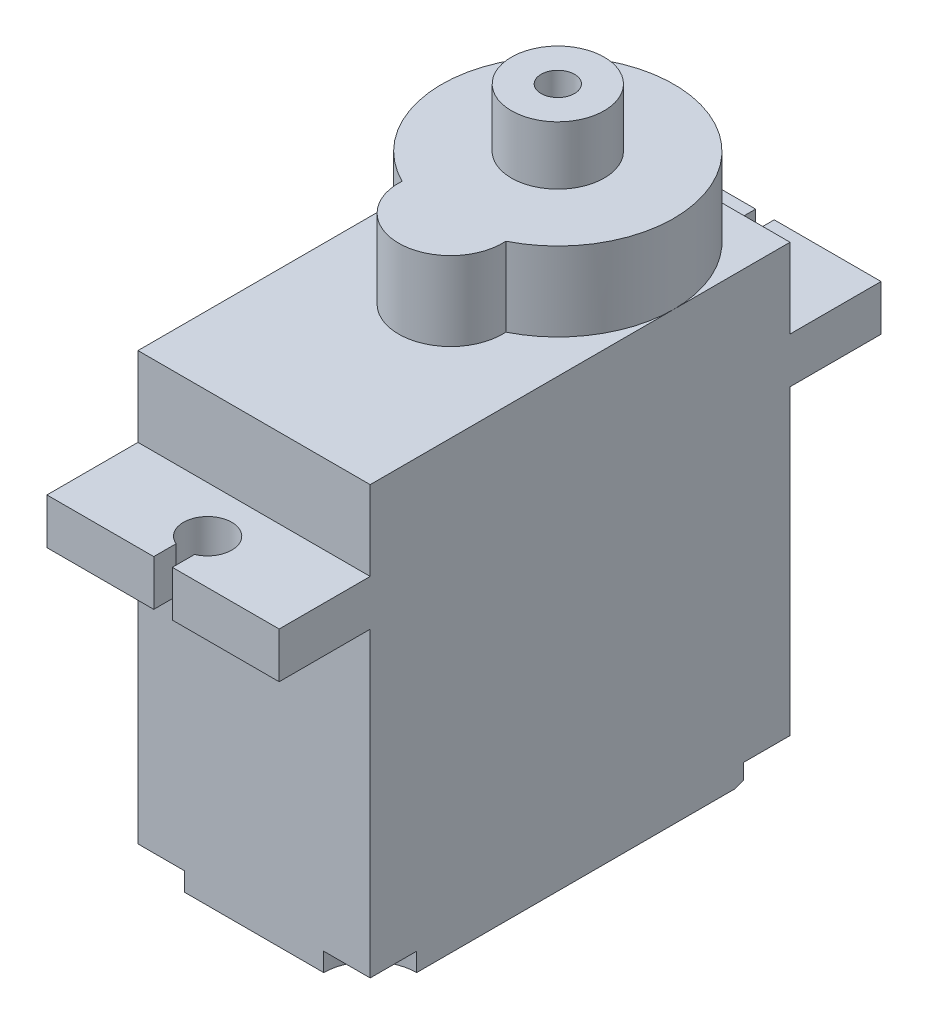
ISO-10303-21;
HEADER;
FILE_DESCRIPTION(('STEP AP214'),'2;1');
FILE_NAME('part.step','',(''),(''),'','','');
FILE_SCHEMA(('AUTOMOTIVE_DESIGN { 1 0 10303 214 1 1 1 1 }'));
ENDSEC;
DATA;
#1=APPLICATION_CONTEXT('core data for automotive mechanical design processes');
#2=APPLICATION_PROTOCOL_DEFINITION('international standard','automotive_design',2000,#1);
#3=PRODUCT_CONTEXT('',#1,'mechanical');
#4=PRODUCT('Part','Part','',(#3));
#5=PRODUCT_RELATED_PRODUCT_CATEGORY('part','',(#4));
#6=PRODUCT_DEFINITION_FORMATION('','',#4);
#7=PRODUCT_DEFINITION_CONTEXT('part definition',#1,'design');
#8=PRODUCT_DEFINITION('design','',#6,#7);
#9=PRODUCT_DEFINITION_SHAPE('','',#8);
#10=(LENGTH_UNIT() NAMED_UNIT(*) SI_UNIT(.MILLI.,.METRE.));
#11=(NAMED_UNIT(*) PLANE_ANGLE_UNIT() SI_UNIT($,.RADIAN.));
#12=(NAMED_UNIT(*) SI_UNIT($,.STERADIAN.) SOLID_ANGLE_UNIT());
#13=UNCERTAINTY_MEASURE_WITH_UNIT(LENGTH_MEASURE(1.E-05),#10,'distance_accuracy_value','');
#14=(GEOMETRIC_REPRESENTATION_CONTEXT(3) GLOBAL_UNCERTAINTY_ASSIGNED_CONTEXT((#13)) GLOBAL_UNIT_ASSIGNED_CONTEXT((#10,
#11,#12)) REPRESENTATION_CONTEXT('',''));
#15=CARTESIAN_POINT('',(0.,0.,0.));
#16=DIRECTION('',(0.,0.,1.));
#17=DIRECTION('',(1.,0.,0.));
#18=AXIS2_PLACEMENT_3D('',#15,#16,#17);
#19=CARTESIAN_POINT('',(6.25,4.28,11.3));
#20=DIRECTION('',(0.,-1.,0.));
#21=DIRECTION('',(0.,0.,-1.));
#22=AXIS2_PLACEMENT_3D('',#19,#20,#21);
#23=PLANE('',#22);
#24=CARTESIAN_POINT('',(0.,4.28,0.719999999999996));
#25=DIRECTION('',(0.,1.,0.));
#26=DIRECTION('',(0.,0.,1.));
#27=AXIS2_PLACEMENT_3D('',#24,#25,#26);
#28=CIRCLE('',#27,2.8);
#29=CARTESIAN_POINT('',(-2.79424619253468,4.28,0.540589254766044));
#30=VERTEX_POINT('',#29);
#31=CARTESIAN_POINT('',(2.79424619253469,4.28,0.54058925476604));
#32=VERTEX_POINT('',#31);
#33=EDGE_CURVE('E460',#30,#32,#28,.T.);
#34=ORIENTED_EDGE('',*,*,#33,.F.);
#35=CARTESIAN_POINT('',(0.,4.28000000000001,-5.04999999999999));
#36=DIRECTION('',(0.,1.,0.));
#37=DIRECTION('',(0.,0.,1.));
#38=AXIS2_PLACEMENT_3D('',#35,#36,#37);
#39=CIRCLE('',#38,6.25);
#40=CARTESIAN_POINT('',(-6.25,4.28000000000001,-5.04999999999999));
#41=VERTEX_POINT('',#40);
#42=EDGE_CURVE('E352',#41,#30,#39,.T.);
#43=ORIENTED_EDGE('',*,*,#42,.F.);
#44=DIRECTION('',(0.,0.,1.));
#45=VECTOR('',#44,1.);
#46=CARTESIAN_POINT('',(-6.25,4.28,11.3));
#47=LINE('',#46,#45);
#48=CARTESIAN_POINT('',(-6.25,4.28,11.3));
#49=VERTEX_POINT('',#48);
#50=EDGE_CURVE('E300',#41,#49,#47,.T.);
#51=ORIENTED_EDGE('',*,*,#50,.T.);
#52=DIRECTION('',(-1.,0.,0.));
#53=VECTOR('',#52,1.);
#54=CARTESIAN_POINT('',(6.25,4.28,11.3));
#55=LINE('',#54,#53);
#56=CARTESIAN_POINT('',(6.25,4.28,11.3));
#57=VERTEX_POINT('',#56);
#58=EDGE_CURVE('E305',#57,#49,#55,.T.);
#59=ORIENTED_EDGE('',*,*,#58,.F.);
#60=DIRECTION('',(0.,0.,1.));
#61=VECTOR('',#60,1.);
#62=CARTESIAN_POINT('',(6.25,4.28,11.3));
#63=LINE('',#62,#61);
#64=CARTESIAN_POINT('',(6.25,4.28000000000001,-5.04999999999999));
#65=VERTEX_POINT('',#64);
#66=EDGE_CURVE('E393',#65,#57,#63,.T.);
#67=ORIENTED_EDGE('',*,*,#66,.F.);
#68=EDGE_CURVE('E467',#32,#65,#39,.T.);
#69=ORIENTED_EDGE('',*,*,#68,.F.);
#70=EDGE_LOOP('',(#34,#43,#51,#59,#67,#69));
#71=FACE_BOUND('',#70,.T.);
#72=ADVANCED_FACE('F48',(#71),#23,.F.);
#73=CARTESIAN_POINT('',(0.,4.28000000000001,-11.3));
#74=VERTEX_POINT('',#73);
#75=EDGE_CURVE('E357',#65,#74,#39,.T.);
#76=ORIENTED_EDGE('',*,*,#75,.F.);
#77=CARTESIAN_POINT('',(6.25,4.28000000000001,-11.3));
#78=VERTEX_POINT('',#77);
#79=EDGE_CURVE('E309',#78,#65,#63,.T.);
#80=ORIENTED_EDGE('',*,*,#79,.F.);
#81=DIRECTION('',(-1.,0.,0.));
#82=VECTOR('',#81,1.);
#83=CARTESIAN_POINT('',(6.25,4.28000000000001,-11.3));
#84=LINE('',#83,#82);
#85=EDGE_CURVE('E310',#78,#74,#84,.T.);
#86=ORIENTED_EDGE('',*,*,#85,.T.);
#87=EDGE_LOOP('',(#76,#80,#86));
#88=FACE_BOUND('',#87,.T.);
#89=ADVANCED_FACE('F572',(#88),#23,.F.);
#90=CARTESIAN_POINT('',(6.25,0.,16.2));
#91=DIRECTION('',(0.,0.,-1.));
#92=DIRECTION('',(-1.,0.,0.));
#93=AXIS2_PLACEMENT_3D('',#90,#91,#92);
#94=PLANE('',#93);
#95=DIRECTION('',(-1.,0.,0.));
#96=VECTOR('',#95,1.);
#97=CARTESIAN_POINT('',(6.25,0.,16.2));
#98=LINE('',#97,#96);
#99=CARTESIAN_POINT('',(6.25,0.,16.2));
#100=VERTEX_POINT('',#99);
#101=CARTESIAN_POINT('',(0.5,0.,16.2));
#102=VERTEX_POINT('',#101);
#103=EDGE_CURVE('E337',#100,#102,#98,.T.);
#104=ORIENTED_EDGE('',*,*,#103,.T.);
#105=DIRECTION('',(0.,1.,0.));
#106=VECTOR('',#105,1.);
#107=CARTESIAN_POINT('',(0.5,-12.5,16.2));
#108=LINE('',#107,#106);
#109=CARTESIAN_POINT('',(0.5,-2.46,16.2));
#110=VERTEX_POINT('',#109);
#111=EDGE_CURVE('E508',#110,#102,#108,.T.);
#112=ORIENTED_EDGE('',*,*,#111,.F.);
#113=DIRECTION('',(-1.,0.,0.));
#114=VECTOR('',#113,1.);
#115=CARTESIAN_POINT('',(6.25,-2.46,16.2));
#116=LINE('',#115,#114);
#117=CARTESIAN_POINT('',(6.25,-2.46,16.2));
#118=VERTEX_POINT('',#117);
#119=EDGE_CURVE('E333',#118,#110,#116,.T.);
#120=ORIENTED_EDGE('',*,*,#119,.F.);
#121=DIRECTION('',(0.,-1.,0.));
#122=VECTOR('',#121,1.);
#123=CARTESIAN_POINT('',(6.25,0.,16.2));
#124=LINE('',#123,#122);
#125=EDGE_CURVE('E525',#100,#118,#124,.T.);
#126=ORIENTED_EDGE('',*,*,#125,.F.);
#127=EDGE_LOOP('',(#104,#112,#120,#126));
#128=FACE_BOUND('',#127,.T.);
#129=ADVANCED_FACE('F533',(#128),#94,.F.);
#130=CARTESIAN_POINT('',(6.25,0.,-16.2));
#131=DIRECTION('',(0.,0.,1.));
#132=DIRECTION('',(1.,0.,0.));
#133=AXIS2_PLACEMENT_3D('',#130,#131,#132);
#134=PLANE('',#133);
#135=DIRECTION('',(-1.,0.,0.));
#136=VECTOR('',#135,1.);
#137=CARTESIAN_POINT('',(6.25,0.,-16.2));
#138=LINE('',#137,#136);
#139=CARTESIAN_POINT('',(-0.5,0.,-16.2));
#140=VERTEX_POINT('',#139);
#141=CARTESIAN_POINT('',(-6.25,0.,-16.2));
#142=VERTEX_POINT('',#141);
#143=EDGE_CURVE('E316',#140,#142,#138,.T.);
#144=ORIENTED_EDGE('',*,*,#143,.F.);
#145=DIRECTION('',(0.,1.,0.));
#146=VECTOR('',#145,1.);
#147=CARTESIAN_POINT('',(-0.5,-12.5,-16.2));
#148=LINE('',#147,#146);
#149=CARTESIAN_POINT('',(-0.5,-2.46,-16.2));
#150=VERTEX_POINT('',#149);
#151=EDGE_CURVE('E492',#150,#140,#148,.T.);
#152=ORIENTED_EDGE('',*,*,#151,.F.);
#153=DIRECTION('',(-1.,0.,0.));
#154=VECTOR('',#153,1.);
#155=CARTESIAN_POINT('',(6.25,-2.46,-16.2));
#156=LINE('',#155,#154);
#157=CARTESIAN_POINT('',(-6.25,-2.46,-16.2));
#158=VERTEX_POINT('',#157);
#159=EDGE_CURVE('E320',#150,#158,#156,.T.);
#160=ORIENTED_EDGE('',*,*,#159,.T.);
#161=DIRECTION('',(0.,1.,0.));
#162=VECTOR('',#161,1.);
#163=CARTESIAN_POINT('',(-6.25,0.,-16.2));
#164=LINE('',#163,#162);
#165=EDGE_CURVE('E292',#158,#142,#164,.T.);
#166=ORIENTED_EDGE('',*,*,#165,.T.);
#167=EDGE_LOOP('',(#144,#152,#160,#166));
#168=FACE_BOUND('',#167,.T.);
#169=ADVANCED_FACE('F589',(#168),#134,.F.);
#170=CARTESIAN_POINT('',(6.25,4.28,11.3));
#171=DIRECTION('',(0.,0.,-1.));
#172=DIRECTION('',(0.,1.,0.));
#173=AXIS2_PLACEMENT_3D('',#170,#171,#172);
#174=PLANE('',#173);
#175=DIRECTION('',(0.,-1.,0.));
#176=VECTOR('',#175,1.);
#177=CARTESIAN_POINT('',(-6.25,4.28,11.3));
#178=LINE('',#177,#176);
#179=CARTESIAN_POINT('',(-6.25,0.,11.3));
#180=VERTEX_POINT('',#179);
#181=EDGE_CURVE('E396',#49,#180,#178,.T.);
#182=ORIENTED_EDGE('',*,*,#181,.T.);
#183=DIRECTION('',(-1.,0.,0.));
#184=VECTOR('',#183,1.);
#185=CARTESIAN_POINT('',(6.25,0.,11.3));
#186=LINE('',#185,#184);
#187=CARTESIAN_POINT('',(6.25,0.,11.3));
#188=VERTEX_POINT('',#187);
#189=EDGE_CURVE('E340',#188,#180,#186,.T.);
#190=ORIENTED_EDGE('',*,*,#189,.F.);
#191=DIRECTION('',(0.,-1.,0.));
#192=VECTOR('',#191,1.);
#193=CARTESIAN_POINT('',(6.25,4.28,11.3));
#194=LINE('',#193,#192);
#195=EDGE_CURVE('E304',#57,#188,#194,.T.);
#196=ORIENTED_EDGE('',*,*,#195,.F.);
#197=ORIENTED_EDGE('',*,*,#58,.T.);
#198=EDGE_LOOP('',(#182,#190,#196,#197));
#199=FACE_BOUND('',#198,.T.);
#200=ADVANCED_FACE('F50',(#199),#174,.F.);
#201=CARTESIAN_POINT('',(6.25,0.,11.3));
#202=DIRECTION('',(0.,-1.,0.));
#203=DIRECTION('',(0.,0.,-1.));
#204=AXIS2_PLACEMENT_3D('',#201,#202,#203);
#205=PLANE('',#204);
#206=CARTESIAN_POINT('',(0.,0.,13.8));
#207=DIRECTION('',(0.,1.,0.));
#208=DIRECTION('',(0.,0.,-1.));
#209=AXIS2_PLACEMENT_3D('',#206,#207,#208);
#210=CIRCLE('',#209,1.3);
#211=CARTESIAN_POINT('',(0.5,0.,15.));
#212=VERTEX_POINT('',#211);
#213=CARTESIAN_POINT('',(-0.5,0.,15.));
#214=VERTEX_POINT('',#213);
#215=EDGE_CURVE('E479',#212,#214,#210,.T.);
#216=ORIENTED_EDGE('',*,*,#215,.F.);
#217=DIRECTION('',(0.,0.,-1.));
#218=VECTOR('',#217,1.);
#219=CARTESIAN_POINT('',(0.5,0.,15.));
#220=LINE('',#219,#218);
#221=EDGE_CURVE('E503',#102,#212,#220,.T.);
#222=ORIENTED_EDGE('',*,*,#221,.F.);
#223=ORIENTED_EDGE('',*,*,#103,.F.);
#224=DIRECTION('',(0.,0.,1.));
#225=VECTOR('',#224,1.);
#226=CARTESIAN_POINT('',(6.25,0.,11.3));
#227=LINE('',#226,#225);
#228=EDGE_CURVE('E523',#188,#100,#227,.T.);
#229=ORIENTED_EDGE('',*,*,#228,.F.);
#230=ORIENTED_EDGE('',*,*,#189,.T.);
#231=DIRECTION('',(0.,0.,1.));
#232=VECTOR('',#231,1.);
#233=CARTESIAN_POINT('',(-6.25,0.,11.3));
#234=LINE('',#233,#232);
#235=CARTESIAN_POINT('',(-6.25,0.,16.2));
#236=VERTEX_POINT('',#235);
#237=EDGE_CURVE('E399',#180,#236,#234,.T.);
#238=ORIENTED_EDGE('',*,*,#237,.T.);
#239=CARTESIAN_POINT('',(-0.5,0.,16.2));
#240=VERTEX_POINT('',#239);
#241=EDGE_CURVE('E336',#240,#236,#98,.T.);
#242=ORIENTED_EDGE('',*,*,#241,.F.);
#243=DIRECTION('',(0.,0.,1.));
#244=VECTOR('',#243,1.);
#245=CARTESIAN_POINT('',(-0.5,0.,15.));
#246=LINE('',#245,#244);
#247=EDGE_CURVE('E501',#214,#240,#246,.T.);
#248=ORIENTED_EDGE('',*,*,#247,.F.);
#249=EDGE_LOOP('',(#216,#222,#223,#229,#230,#238,#242,#248));
#250=FACE_BOUND('',#249,.T.);
#251=ADVANCED_FACE('F541',(#250),#205,.F.);
#252=CARTESIAN_POINT('',(-0.5,-2.46,16.2));
#253=VERTEX_POINT('',#252);
#254=CARTESIAN_POINT('',(-6.25,-2.46,16.2));
#255=VERTEX_POINT('',#254);
#256=EDGE_CURVE('E332',#253,#255,#116,.T.);
#257=ORIENTED_EDGE('',*,*,#256,.F.);
#258=DIRECTION('',(0.,1.,0.));
#259=VECTOR('',#258,1.);
#260=CARTESIAN_POINT('',(-0.5,-12.5,16.2));
#261=LINE('',#260,#259);
#262=EDGE_CURVE('E510',#253,#240,#261,.T.);
#263=ORIENTED_EDGE('',*,*,#262,.T.);
#264=ORIENTED_EDGE('',*,*,#241,.T.);
#265=DIRECTION('',(0.,-1.,0.));
#266=VECTOR('',#265,1.);
#267=CARTESIAN_POINT('',(-6.25,0.,16.2));
#268=LINE('',#267,#266);
#269=EDGE_CURVE('E403',#236,#255,#268,.T.);
#270=ORIENTED_EDGE('',*,*,#269,.T.);
#271=EDGE_LOOP('',(#257,#263,#264,#270));
#272=FACE_BOUND('',#271,.T.);
#273=ADVANCED_FACE('F549',(#272),#94,.F.);
#274=CARTESIAN_POINT('',(6.25,-2.46,11.3));
#275=DIRECTION('',(0.,1.,0.));
#276=DIRECTION('',(0.,0.,1.));
#277=AXIS2_PLACEMENT_3D('',#274,#275,#276);
#278=PLANE('',#277);
#279=ORIENTED_EDGE('',*,*,#119,.T.);
#280=DIRECTION('',(0.,0.,-1.));
#281=VECTOR('',#280,1.);
#282=CARTESIAN_POINT('',(0.5,-2.46,11.3));
#283=LINE('',#282,#281);
#284=CARTESIAN_POINT('',(0.5,-2.46,15.));
#285=VERTEX_POINT('',#284);
#286=EDGE_CURVE('E349',#110,#285,#283,.T.);
#287=ORIENTED_EDGE('',*,*,#286,.T.);
#288=CARTESIAN_POINT('',(0.,-2.46,13.8));
#289=DIRECTION('',(0.,1.,0.));
#290=DIRECTION('',(0.,0.,1.));
#291=AXIS2_PLACEMENT_3D('',#288,#289,#290);
#292=CIRCLE('',#291,1.3);
#293=CARTESIAN_POINT('',(-0.5,-2.46,15.));
#294=VERTEX_POINT('',#293);
#295=EDGE_CURVE('E346',#285,#294,#292,.T.);
#296=ORIENTED_EDGE('',*,*,#295,.T.);
#297=DIRECTION('',(0.,0.,1.));
#298=VECTOR('',#297,1.);
#299=CARTESIAN_POINT('',(-0.5,-2.46,11.3));
#300=LINE('',#299,#298);
#301=EDGE_CURVE('E343',#294,#253,#300,.T.);
#302=ORIENTED_EDGE('',*,*,#301,.T.);
#303=ORIENTED_EDGE('',*,*,#256,.T.);
#304=DIRECTION('',(0.,0.,-1.));
#305=VECTOR('',#304,1.);
#306=CARTESIAN_POINT('',(-6.25,-2.46,11.3));
#307=LINE('',#306,#305);
#308=CARTESIAN_POINT('',(-6.25,-2.46,11.3));
#309=VERTEX_POINT('',#308);
#310=EDGE_CURVE('E286',#255,#309,#307,.T.);
#311=ORIENTED_EDGE('',*,*,#310,.T.);
#312=DIRECTION('',(-1.,0.,0.));
#313=VECTOR('',#312,1.);
#314=CARTESIAN_POINT('',(6.25,-2.46,11.3));
#315=LINE('',#314,#313);
#316=CARTESIAN_POINT('',(6.25,-2.46,11.3));
#317=VERTEX_POINT('',#316);
#318=EDGE_CURVE('E329',#317,#309,#315,.T.);
#319=ORIENTED_EDGE('',*,*,#318,.F.);
#320=DIRECTION('',(0.,0.,-1.));
#321=VECTOR('',#320,1.);
#322=CARTESIAN_POINT('',(6.25,-2.46,11.3));
#323=LINE('',#322,#321);
#324=EDGE_CURVE('E527',#118,#317,#323,.T.);
#325=ORIENTED_EDGE('',*,*,#324,.F.);
#326=EDGE_LOOP('',(#279,#287,#296,#302,#303,#311,#319,#325));
#327=FACE_BOUND('',#326,.T.);
#328=ADVANCED_FACE('F408',(#327),#278,.F.);
#329=CARTESIAN_POINT('',(6.25,-2.46,11.3));
#330=DIRECTION('',(0.,0.,-1.));
#331=DIRECTION('',(-1.,0.,0.));
#332=AXIS2_PLACEMENT_3D('',#329,#330,#331);
#333=PLANE('',#332);
#334=DIRECTION('',(1.,0.,0.));
#335=VECTOR('',#334,1.);
#336=CARTESIAN_POINT('',(6.25,-18.72,11.3));
#337=LINE('',#336,#335);
#338=CARTESIAN_POINT('',(-6.25,-18.72,11.3));
#339=VERTEX_POINT('',#338);
#340=CARTESIAN_POINT('',(-3.75,-18.72,11.3));
#341=VERTEX_POINT('',#340);
#342=EDGE_CURVE('E425',#339,#341,#337,.T.);
#343=ORIENTED_EDGE('',*,*,#342,.T.);
#344=DIRECTION('',(0.,-1.,0.));
#345=VECTOR('',#344,1.);
#346=CARTESIAN_POINT('',(-3.75,-18.72,11.3));
#347=LINE('',#346,#345);
#348=CARTESIAN_POINT('',(-3.75,-19.72,11.3));
#349=VERTEX_POINT('',#348);
#350=EDGE_CURVE('E429',#341,#349,#347,.T.);
#351=ORIENTED_EDGE('',*,*,#350,.T.);
#352=DIRECTION('',(-1.,0.,0.));
#353=VECTOR('',#352,1.);
#354=CARTESIAN_POINT('',(6.25,-19.72,11.3));
#355=LINE('',#354,#353);
#356=CARTESIAN_POINT('',(3.75,-19.72,11.3));
#357=VERTEX_POINT('',#356);
#358=EDGE_CURVE('E327',#357,#349,#355,.T.);
#359=ORIENTED_EDGE('',*,*,#358,.F.);
#360=DIRECTION('',(0.,-1.,0.));
#361=VECTOR('',#360,1.);
#362=CARTESIAN_POINT('',(3.75,-18.72,11.3));
#363=LINE('',#362,#361);
#364=CARTESIAN_POINT('',(3.75,-18.72,11.3));
#365=VERTEX_POINT('',#364);
#366=EDGE_CURVE('E449',#357,#365,#363,.F.);
#367=ORIENTED_EDGE('',*,*,#366,.T.);
#368=DIRECTION('',(-1.,0.,0.));
#369=VECTOR('',#368,1.);
#370=CARTESIAN_POINT('',(6.25,-18.72,11.3));
#371=LINE('',#370,#369);
#372=CARTESIAN_POINT('',(6.25,-18.72,11.3));
#373=VERTEX_POINT('',#372);
#374=EDGE_CURVE('E447',#373,#365,#371,.T.);
#375=ORIENTED_EDGE('',*,*,#374,.F.);
#376=DIRECTION('',(0.,-1.,0.));
#377=VECTOR('',#376,1.);
#378=CARTESIAN_POINT('',(6.25,-2.46,11.3));
#379=LINE('',#378,#377);
#380=EDGE_CURVE('E384',#317,#373,#379,.T.);
#381=ORIENTED_EDGE('',*,*,#380,.F.);
#382=ORIENTED_EDGE('',*,*,#318,.T.);
#383=DIRECTION('',(0.,-1.,0.));
#384=VECTOR('',#383,1.);
#385=CARTESIAN_POINT('',(-6.25,-2.46,11.3));
#386=LINE('',#385,#384);
#387=EDGE_CURVE('E281',#309,#339,#386,.T.);
#388=ORIENTED_EDGE('',*,*,#387,.T.);
#389=EDGE_LOOP('',(#343,#351,#359,#367,#375,#381,#382,#388));
#390=FACE_BOUND('',#389,.T.);
#391=ADVANCED_FACE('F416',(#390),#333,.F.);
#392=CARTESIAN_POINT('',(6.25,-19.72,11.3));
#393=DIRECTION('',(0.,1.,0.));
#394=DIRECTION('',(0.,0.,1.));
#395=AXIS2_PLACEMENT_3D('',#392,#393,#394);
#396=PLANE('',#395);
#397=DIRECTION('',(0.,0.,-1.));
#398=VECTOR('',#397,1.);
#399=CARTESIAN_POINT('',(-6.25,-19.72,11.3));
#400=LINE('',#399,#398);
#401=CARTESIAN_POINT('',(-6.25,-19.72,8.8));
#402=VERTEX_POINT('',#401);
#403=CARTESIAN_POINT('',(-6.25,-19.72,-8.3));
#404=VERTEX_POINT('',#403);
#405=EDGE_CURVE('E272',#402,#404,#400,.T.);
#406=ORIENTED_EDGE('',*,*,#405,.T.);
#407=DIRECTION('',(-1.,0.,0.));
#408=VECTOR('',#407,1.);
#409=CARTESIAN_POINT('',(9.41227766016838,-19.72,-8.3));
#410=LINE('',#409,#408);
#411=CARTESIAN_POINT('',(6.25,-19.72,-8.3));
#412=VERTEX_POINT('',#411);
#413=EDGE_CURVE('E254',#412,#404,#410,.T.);
#414=ORIENTED_EDGE('',*,*,#413,.F.);
#415=DIRECTION('',(0.,0.,-1.));
#416=VECTOR('',#415,1.);
#417=CARTESIAN_POINT('',(6.25,-19.72,11.3));
#418=LINE('',#417,#416);
#419=CARTESIAN_POINT('',(6.25,-19.72,8.8));
#420=VERTEX_POINT('',#419);
#421=EDGE_CURVE('E380',#420,#412,#418,.T.);
#422=ORIENTED_EDGE('',*,*,#421,.F.);
#423=CARTESIAN_POINT('',(6.25,-19.72,11.3));
#424=DIRECTION('',(0.,-1.,0.));
#425=DIRECTION('',(0.,0.,-1.));
#426=AXIS2_PLACEMENT_3D('',#423,#424,#425);
#427=CIRCLE('',#426,2.5);
#428=EDGE_CURVE('E441',#357,#420,#427,.T.);
#429=ORIENTED_EDGE('',*,*,#428,.F.);
#430=ORIENTED_EDGE('',*,*,#358,.T.);
#431=CARTESIAN_POINT('',(-6.25,-19.72,11.3));
#432=DIRECTION('',(0.,-1.,0.));
#433=DIRECTION('',(0.,0.,1.));
#434=AXIS2_PLACEMENT_3D('',#431,#432,#433);
#435=CIRCLE('',#434,2.5);
#436=EDGE_CURVE('E279',#402,#349,#435,.T.);
#437=ORIENTED_EDGE('',*,*,#436,.F.);
#438=EDGE_LOOP('',(#406,#414,#422,#429,#430,#437));
#439=FACE_BOUND('',#438,.T.);
#440=ADVANCED_FACE('F277',(#439),#396,.F.);
#441=CARTESIAN_POINT('',(6.25,-2.46,-11.3));
#442=DIRECTION('',(0.,0.,1.));
#443=DIRECTION('',(0.,-1.,0.));
#444=AXIS2_PLACEMENT_3D('',#441,#442,#443);
#445=PLANE('',#444);
#446=DIRECTION('',(-1.,0.,0.));
#447=VECTOR('',#446,1.);
#448=CARTESIAN_POINT('',(6.25,-18.72,-11.3));
#449=LINE('',#448,#447);
#450=CARTESIAN_POINT('',(6.25,-18.72,-11.3));
#451=VERTEX_POINT('',#450);
#452=CARTESIAN_POINT('',(3.75,-18.72,-11.3));
#453=VERTEX_POINT('',#452);
#454=EDGE_CURVE('E71',#451,#453,#449,.T.);
#455=ORIENTED_EDGE('',*,*,#454,.T.);
#456=DIRECTION('',(-1.,0.,0.));
#457=VECTOR('',#456,1.);
#458=CARTESIAN_POINT('',(9.41227766016838,-18.72,-11.3));
#459=LINE('',#458,#457);
#460=CARTESIAN_POINT('',(-3.75,-18.72,-11.3));
#461=VERTEX_POINT('',#460);
#462=EDGE_CURVE('E265',#453,#461,#459,.T.);
#463=ORIENTED_EDGE('',*,*,#462,.T.);
#464=DIRECTION('',(1.,0.,0.));
#465=VECTOR('',#464,1.);
#466=CARTESIAN_POINT('',(6.25,-18.72,-11.3));
#467=LINE('',#466,#465);
#468=CARTESIAN_POINT('',(-6.25,-18.72,-11.3));
#469=VERTEX_POINT('',#468);
#470=EDGE_CURVE('E440',#469,#461,#467,.T.);
#471=ORIENTED_EDGE('',*,*,#470,.F.);
#472=DIRECTION('',(0.,1.,0.));
#473=VECTOR('',#472,1.);
#474=CARTESIAN_POINT('',(-6.25,-2.46,-11.3));
#475=LINE('',#474,#473);
#476=CARTESIAN_POINT('',(-6.25,-2.46,-11.3));
#477=VERTEX_POINT('',#476);
#478=EDGE_CURVE('E280',#469,#477,#475,.T.);
#479=ORIENTED_EDGE('',*,*,#478,.T.);
#480=DIRECTION('',(-1.,0.,0.));
#481=VECTOR('',#480,1.);
#482=CARTESIAN_POINT('',(6.25,-2.46,-11.3));
#483=LINE('',#482,#481);
#484=CARTESIAN_POINT('',(6.25,-2.46,-11.3));
#485=VERTEX_POINT('',#484);
#486=EDGE_CURVE('E324',#485,#477,#483,.T.);
#487=ORIENTED_EDGE('',*,*,#486,.F.);
#488=DIRECTION('',(0.,1.,0.));
#489=VECTOR('',#488,1.);
#490=CARTESIAN_POINT('',(6.25,-2.46,-11.3));
#491=LINE('',#490,#489);
#492=EDGE_CURVE('E371',#451,#485,#491,.T.);
#493=ORIENTED_EDGE('',*,*,#492,.F.);
#494=EDGE_LOOP('',(#455,#463,#471,#479,#487,#493));
#495=FACE_BOUND('',#494,.T.);
#496=ADVANCED_FACE('F376',(#495),#445,.F.);
#497=CARTESIAN_POINT('',(6.25,-2.46,-11.3));
#498=DIRECTION('',(0.,1.,0.));
#499=DIRECTION('',(0.,0.,1.));
#500=AXIS2_PLACEMENT_3D('',#497,#498,#499);
#501=PLANE('',#500);
#502=ORIENTED_EDGE('',*,*,#159,.F.);
#503=DIRECTION('',(0.,0.,1.));
#504=VECTOR('',#503,1.);
#505=CARTESIAN_POINT('',(-0.5,-2.46,-11.3));
#506=LINE('',#505,#504);
#507=CARTESIAN_POINT('',(-0.5,-2.46,-15.));
#508=VERTEX_POINT('',#507);
#509=EDGE_CURVE('E516',#150,#508,#506,.T.);
#510=ORIENTED_EDGE('',*,*,#509,.T.);
#511=CARTESIAN_POINT('',(0.,-2.46,-13.8));
#512=DIRECTION('',(0.,1.,0.));
#513=DIRECTION('',(0.,0.,1.));
#514=AXIS2_PLACEMENT_3D('',#511,#512,#513);
#515=CIRCLE('',#514,1.3);
#516=CARTESIAN_POINT('',(0.5,-2.46,-15.));
#517=VERTEX_POINT('',#516);
#518=EDGE_CURVE('E400',#508,#517,#515,.T.);
#519=ORIENTED_EDGE('',*,*,#518,.T.);
#520=DIRECTION('',(0.,0.,-1.));
#521=VECTOR('',#520,1.);
#522=CARTESIAN_POINT('',(0.5,-2.46,-11.3));
#523=LINE('',#522,#521);
#524=CARTESIAN_POINT('',(0.5,-2.46,-16.2));
#525=VERTEX_POINT('',#524);
#526=EDGE_CURVE('E491',#517,#525,#523,.T.);
#527=ORIENTED_EDGE('',*,*,#526,.T.);
#528=CARTESIAN_POINT('',(6.25,-2.46,-16.2));
#529=VERTEX_POINT('',#528);
#530=EDGE_CURVE('E321',#529,#525,#156,.T.);
#531=ORIENTED_EDGE('',*,*,#530,.F.);
#532=DIRECTION('',(0.,0.,-1.));
#533=VECTOR('',#532,1.);
#534=CARTESIAN_POINT('',(6.25,-2.46,-11.3));
#535=LINE('',#534,#533);
#536=EDGE_CURVE('E379',#485,#529,#535,.T.);
#537=ORIENTED_EDGE('',*,*,#536,.F.);
#538=ORIENTED_EDGE('',*,*,#486,.T.);
#539=DIRECTION('',(0.,0.,-1.));
#540=VECTOR('',#539,1.);
#541=CARTESIAN_POINT('',(-6.25,-2.46,-11.3));
#542=LINE('',#541,#540);
#543=EDGE_CURVE('E283',#477,#158,#542,.T.);
#544=ORIENTED_EDGE('',*,*,#543,.T.);
#545=EDGE_LOOP('',(#502,#510,#519,#527,#531,#537,#538,#544));
#546=FACE_BOUND('',#545,.T.);
#547=ADVANCED_FACE('F592',(#546),#501,.F.);
#548=ORIENTED_EDGE('',*,*,#530,.T.);
#549=DIRECTION('',(0.,1.,0.));
#550=VECTOR('',#549,1.);
#551=CARTESIAN_POINT('',(0.5,-12.5,-16.2));
#552=LINE('',#551,#550);
#553=CARTESIAN_POINT('',(0.5,0.,-16.2));
#554=VERTEX_POINT('',#553);
#555=EDGE_CURVE('E494',#525,#554,#552,.T.);
#556=ORIENTED_EDGE('',*,*,#555,.T.);
#557=CARTESIAN_POINT('',(6.25,0.,-16.2));
#558=VERTEX_POINT('',#557);
#559=EDGE_CURVE('E317',#558,#554,#138,.T.);
#560=ORIENTED_EDGE('',*,*,#559,.F.);
#561=DIRECTION('',(0.,1.,0.));
#562=VECTOR('',#561,1.);
#563=CARTESIAN_POINT('',(6.25,0.,-16.2));
#564=LINE('',#563,#562);
#565=EDGE_CURVE('E382',#529,#558,#564,.T.);
#566=ORIENTED_EDGE('',*,*,#565,.F.);
#567=EDGE_LOOP('',(#548,#556,#560,#566));
#568=FACE_BOUND('',#567,.T.);
#569=ADVANCED_FACE('F639',(#568),#134,.F.);
#570=CARTESIAN_POINT('',(6.25,0.,-11.3));
#571=DIRECTION('',(0.,-1.,0.));
#572=DIRECTION('',(0.,0.,-1.));
#573=AXIS2_PLACEMENT_3D('',#570,#571,#572);
#574=PLANE('',#573);
#575=CARTESIAN_POINT('',(0.,0.,-13.8));
#576=DIRECTION('',(0.,1.,0.));
#577=DIRECTION('',(0.,0.,1.));
#578=AXIS2_PLACEMENT_3D('',#575,#576,#577);
#579=CIRCLE('',#578,1.3);
#580=CARTESIAN_POINT('',(-0.5,0.,-15.));
#581=VERTEX_POINT('',#580);
#582=CARTESIAN_POINT('',(0.500000000000001,0.,-15.));
#583=VERTEX_POINT('',#582);
#584=EDGE_CURVE('E480',#581,#583,#579,.T.);
#585=ORIENTED_EDGE('',*,*,#584,.F.);
#586=DIRECTION('',(0.,0.,1.));
#587=VECTOR('',#586,1.);
#588=CARTESIAN_POINT('',(-0.5,0.,-15.));
#589=LINE('',#588,#587);
#590=EDGE_CURVE('E485',#140,#581,#589,.T.);
#591=ORIENTED_EDGE('',*,*,#590,.F.);
#592=ORIENTED_EDGE('',*,*,#143,.T.);
#593=DIRECTION('',(0.,0.,1.));
#594=VECTOR('',#593,1.);
#595=CARTESIAN_POINT('',(-6.25,0.,-11.3));
#596=LINE('',#595,#594);
#597=CARTESIAN_POINT('',(-6.25,0.,-11.3));
#598=VERTEX_POINT('',#597);
#599=EDGE_CURVE('E295',#142,#598,#596,.T.);
#600=ORIENTED_EDGE('',*,*,#599,.T.);
#601=DIRECTION('',(-1.,0.,0.));
#602=VECTOR('',#601,1.);
#603=CARTESIAN_POINT('',(6.25,0.,-11.3));
#604=LINE('',#603,#602);
#605=CARTESIAN_POINT('',(6.25,0.,-11.3));
#606=VERTEX_POINT('',#605);
#607=EDGE_CURVE('E313',#606,#598,#604,.T.);
#608=ORIENTED_EDGE('',*,*,#607,.F.);
#609=DIRECTION('',(0.,0.,1.));
#610=VECTOR('',#609,1.);
#611=CARTESIAN_POINT('',(6.25,0.,-11.3));
#612=LINE('',#611,#610);
#613=EDGE_CURVE('E389',#558,#606,#612,.T.);
#614=ORIENTED_EDGE('',*,*,#613,.F.);
#615=ORIENTED_EDGE('',*,*,#559,.T.);
#616=DIRECTION('',(0.,0.,-1.));
#617=VECTOR('',#616,1.);
#618=CARTESIAN_POINT('',(0.5,0.,-15.));
#619=LINE('',#618,#617);
#620=EDGE_CURVE('E482',#583,#554,#619,.T.);
#621=ORIENTED_EDGE('',*,*,#620,.F.);
#622=EDGE_LOOP('',(#585,#591,#592,#600,#608,#614,#615,#621));
#623=FACE_BOUND('',#622,.T.);
#624=ADVANCED_FACE('F583',(#623),#574,.F.);
#625=CARTESIAN_POINT('',(6.25,4.28000000000001,-11.3));
#626=DIRECTION('',(0.,0.,1.));
#627=DIRECTION('',(0.,-1.,0.));
#628=AXIS2_PLACEMENT_3D('',#625,#626,#627);
#629=PLANE('',#628);
#630=DIRECTION('',(0.,1.,0.));
#631=VECTOR('',#630,1.);
#632=CARTESIAN_POINT('',(-6.25,4.28000000000001,-11.3));
#633=LINE('',#632,#631);
#634=CARTESIAN_POINT('',(-6.25,4.28000000000001,-11.3));
#635=VERTEX_POINT('',#634);
#636=EDGE_CURVE('E297',#598,#635,#633,.T.);
#637=ORIENTED_EDGE('',*,*,#636,.T.);
#638=EDGE_CURVE('E308',#74,#635,#84,.T.);
#639=ORIENTED_EDGE('',*,*,#638,.F.);
#640=ORIENTED_EDGE('',*,*,#85,.F.);
#641=DIRECTION('',(0.,1.,0.));
#642=VECTOR('',#641,1.);
#643=CARTESIAN_POINT('',(6.25,4.28000000000001,-11.3));
#644=LINE('',#643,#642);
#645=EDGE_CURVE('E391',#606,#78,#644,.T.);
#646=ORIENTED_EDGE('',*,*,#645,.F.);
#647=ORIENTED_EDGE('',*,*,#607,.T.);
#648=EDGE_LOOP('',(#637,#639,#640,#646,#647));
#649=FACE_BOUND('',#648,.T.);
#650=ADVANCED_FACE('F576',(#649),#629,.F.);
#651=EDGE_CURVE('E564',#74,#41,#39,.T.);
#652=ORIENTED_EDGE('',*,*,#651,.F.);
#653=ORIENTED_EDGE('',*,*,#638,.T.);
#654=EDGE_CURVE('E301',#635,#41,#47,.T.);
#655=ORIENTED_EDGE('',*,*,#654,.T.);
#656=EDGE_LOOP('',(#652,#653,#655));
#657=FACE_BOUND('',#656,.T.);
#658=ADVANCED_FACE('F563',(#657),#23,.F.);
#659=CARTESIAN_POINT('',(6.25,0.,0.));
#660=DIRECTION('',(-1.,0.,0.));
#661=DIRECTION('',(0.,0.,1.));
#662=AXIS2_PLACEMENT_3D('',#659,#660,#661);
#663=PLANE('',#662);
#664=ORIENTED_EDGE('',*,*,#421,.T.);
#665=DIRECTION('',(0.,-0.316227766016838,0.948683298050514));
#666=VECTOR('',#665,1.);
#667=CARTESIAN_POINT('',(6.25,-19.72,-8.3));
#668=LINE('',#667,#666);
#669=CARTESIAN_POINT('',(6.25,-19.5533333333333,-8.8));
#670=VERTEX_POINT('',#669);
#671=EDGE_CURVE('E260',#670,#412,#668,.T.);
#672=ORIENTED_EDGE('',*,*,#671,.F.);
#673=DIRECTION('',(0.,-1.,0.));
#674=VECTOR('',#673,1.);
#675=CARTESIAN_POINT('',(6.25,-18.72,-8.8));
#676=LINE('',#675,#674);
#677=CARTESIAN_POINT('',(6.25,-18.72,-8.8));
#678=VERTEX_POINT('',#677);
#679=EDGE_CURVE('E13',#670,#678,#676,.F.);
#680=ORIENTED_EDGE('',*,*,#679,.T.);
#681=DIRECTION('',(0.,0.,-1.));
#682=VECTOR('',#681,1.);
#683=CARTESIAN_POINT('',(6.25,-18.72,0.));
#684=LINE('',#683,#682);
#685=EDGE_CURVE('E56',#678,#451,#684,.T.);
#686=ORIENTED_EDGE('',*,*,#685,.T.);
#687=ORIENTED_EDGE('',*,*,#492,.T.);
#688=ORIENTED_EDGE('',*,*,#536,.T.);
#689=ORIENTED_EDGE('',*,*,#565,.T.);
#690=ORIENTED_EDGE('',*,*,#613,.T.);
#691=ORIENTED_EDGE('',*,*,#645,.T.);
#692=ORIENTED_EDGE('',*,*,#79,.T.);
#693=ORIENTED_EDGE('',*,*,#66,.T.);
#694=ORIENTED_EDGE('',*,*,#195,.T.);
#695=ORIENTED_EDGE('',*,*,#228,.T.);
#696=ORIENTED_EDGE('',*,*,#125,.T.);
#697=ORIENTED_EDGE('',*,*,#324,.T.);
#698=ORIENTED_EDGE('',*,*,#380,.T.);
#699=DIRECTION('',(0.,0.,1.));
#700=VECTOR('',#699,1.);
#701=CARTESIAN_POINT('',(6.25,-18.72,0.));
#702=LINE('',#701,#700);
#703=CARTESIAN_POINT('',(6.25,-18.72,8.8));
#704=VERTEX_POINT('',#703);
#705=EDGE_CURVE('E364',#704,#373,#702,.T.);
#706=ORIENTED_EDGE('',*,*,#705,.F.);
#707=DIRECTION('',(0.,-1.,0.));
#708=VECTOR('',#707,1.);
#709=CARTESIAN_POINT('',(6.25,-18.72,8.8));
#710=LINE('',#709,#708);
#711=EDGE_CURVE('E366',#704,#420,#710,.T.);
#712=ORIENTED_EDGE('',*,*,#711,.T.);
#713=EDGE_LOOP('',(#664,#672,#680,#686,#687,#688,#689,#690,#691,#692,#693,#694,#695,#696,#697,
#698,#706,#712));
#714=FACE_BOUND('',#713,.T.);
#715=ADVANCED_FACE('F370',(#714),#663,.F.);
#716=CARTESIAN_POINT('',(-6.25,0.,0.));
#717=DIRECTION('',(-1.,0.,0.));
#718=DIRECTION('',(0.,0.,1.));
#719=AXIS2_PLACEMENT_3D('',#716,#717,#718);
#720=PLANE('',#719);
#721=DIRECTION('',(0.,0.316227766016838,-0.948683298050514));
#722=VECTOR('',#721,1.);
#723=CARTESIAN_POINT('',(-6.25,-19.72,-8.3));
#724=LINE('',#723,#722);
#725=CARTESIAN_POINT('',(-6.25,-19.5533333333333,-8.8));
#726=VERTEX_POINT('',#725);
#727=EDGE_CURVE('E257',#404,#726,#724,.T.);
#728=ORIENTED_EDGE('',*,*,#727,.F.);
#729=ORIENTED_EDGE('',*,*,#405,.F.);
#730=DIRECTION('',(0.,-1.,0.));
#731=VECTOR('',#730,1.);
#732=CARTESIAN_POINT('',(-6.25,-18.72,8.8));
#733=LINE('',#732,#731);
#734=CARTESIAN_POINT('',(-6.25,-18.72,8.8));
#735=VERTEX_POINT('',#734);
#736=EDGE_CURVE('E362',#735,#402,#733,.T.);
#737=ORIENTED_EDGE('',*,*,#736,.F.);
#738=DIRECTION('',(0.,0.,-1.));
#739=VECTOR('',#738,1.);
#740=CARTESIAN_POINT('',(-6.25,-18.72,0.));
#741=LINE('',#740,#739);
#742=EDGE_CURVE('E360',#339,#735,#741,.T.);
#743=ORIENTED_EDGE('',*,*,#742,.F.);
#744=ORIENTED_EDGE('',*,*,#387,.F.);
#745=ORIENTED_EDGE('',*,*,#310,.F.);
#746=ORIENTED_EDGE('',*,*,#269,.F.);
#747=ORIENTED_EDGE('',*,*,#237,.F.);
#748=ORIENTED_EDGE('',*,*,#181,.F.);
#749=ORIENTED_EDGE('',*,*,#50,.F.);
#750=ORIENTED_EDGE('',*,*,#654,.F.);
#751=ORIENTED_EDGE('',*,*,#636,.F.);
#752=ORIENTED_EDGE('',*,*,#599,.F.);
#753=ORIENTED_EDGE('',*,*,#165,.F.);
#754=ORIENTED_EDGE('',*,*,#543,.F.);
#755=ORIENTED_EDGE('',*,*,#478,.F.);
#756=DIRECTION('',(0.,0.,1.));
#757=VECTOR('',#756,1.);
#758=CARTESIAN_POINT('',(-6.25,-18.72,0.));
#759=LINE('',#758,#757);
#760=CARTESIAN_POINT('',(-6.25,-18.72,-8.8));
#761=VERTEX_POINT('',#760);
#762=EDGE_CURVE('E356',#469,#761,#759,.T.);
#763=ORIENTED_EDGE('',*,*,#762,.T.);
#764=DIRECTION('',(0.,-1.,0.));
#765=VECTOR('',#764,1.);
#766=CARTESIAN_POINT('',(-6.25,-18.72,-8.8));
#767=LINE('',#766,#765);
#768=EDGE_CURVE('E274',#726,#761,#767,.F.);
#769=ORIENTED_EDGE('',*,*,#768,.F.);
#770=EDGE_LOOP('',(#728,#729,#737,#743,#744,#745,#746,#747,#748,#749,#750,#751,#752,#753,#754,
#755,#763,#769));
#771=FACE_BOUND('',#770,.T.);
#772=ADVANCED_FACE('F270',(#771),#720,.T.);
#773=CARTESIAN_POINT('',(0.,-12.5,-13.8));
#774=DIRECTION('',(0.,1.,0.));
#775=DIRECTION('',(0.,0.,1.));
#776=AXIS2_PLACEMENT_3D('',#773,#774,#775);
#777=CYLINDRICAL_SURFACE('',#776,1.3);
#778=DIRECTION('',(0.,1.,0.));
#779=VECTOR('',#778,1.);
#780=CARTESIAN_POINT('',(-0.5,-12.5,-15.));
#781=LINE('',#780,#779);
#782=EDGE_CURVE('E489',#508,#581,#781,.T.);
#783=ORIENTED_EDGE('',*,*,#782,.T.);
#784=ORIENTED_EDGE('',*,*,#584,.T.);
#785=DIRECTION('',(0.,1.,0.));
#786=VECTOR('',#785,1.);
#787=CARTESIAN_POINT('',(0.5,-12.5,-15.));
#788=LINE('',#787,#786);
#789=EDGE_CURVE('E488',#517,#583,#788,.T.);
#790=ORIENTED_EDGE('',*,*,#789,.F.);
#791=ORIENTED_EDGE('',*,*,#518,.F.);
#792=EDGE_LOOP('',(#783,#784,#790,#791));
#793=FACE_BOUND('',#792,.T.);
#794=ADVANCED_FACE('F822',(#793),#777,.F.);
#795=CARTESIAN_POINT('',(-0.5,-12.5,-15.));
#796=DIRECTION('',(-1.,0.,0.));
#797=DIRECTION('',(0.,0.,1.));
#798=AXIS2_PLACEMENT_3D('',#795,#796,#797);
#799=PLANE('',#798);
#800=ORIENTED_EDGE('',*,*,#151,.T.);
#801=ORIENTED_EDGE('',*,*,#590,.T.);
#802=ORIENTED_EDGE('',*,*,#782,.F.);
#803=ORIENTED_EDGE('',*,*,#509,.F.);
#804=EDGE_LOOP('',(#800,#801,#802,#803));
#805=FACE_BOUND('',#804,.T.);
#806=ADVANCED_FACE('F867',(#805),#799,.F.);
#807=CARTESIAN_POINT('',(0.5,-12.5,-15.));
#808=DIRECTION('',(1.,0.,0.));
#809=DIRECTION('',(0.,0.,-1.));
#810=AXIS2_PLACEMENT_3D('',#807,#808,#809);
#811=PLANE('',#810);
#812=ORIENTED_EDGE('',*,*,#789,.T.);
#813=ORIENTED_EDGE('',*,*,#620,.T.);
#814=ORIENTED_EDGE('',*,*,#555,.F.);
#815=ORIENTED_EDGE('',*,*,#526,.F.);
#816=EDGE_LOOP('',(#812,#813,#814,#815));
#817=FACE_BOUND('',#816,.T.);
#818=ADVANCED_FACE('F876',(#817),#811,.F.);
#819=CARTESIAN_POINT('',(0.,-12.5,13.8));
#820=DIRECTION('',(0.,1.,0.));
#821=DIRECTION('',(0.,0.,1.));
#822=AXIS2_PLACEMENT_3D('',#819,#820,#821);
#823=CYLINDRICAL_SURFACE('',#822,1.3);
#824=DIRECTION('',(0.,1.,0.));
#825=VECTOR('',#824,1.);
#826=CARTESIAN_POINT('',(0.5,-12.5,15.));
#827=LINE('',#826,#825);
#828=EDGE_CURVE('E483',#285,#212,#827,.T.);
#829=ORIENTED_EDGE('',*,*,#828,.T.);
#830=ORIENTED_EDGE('',*,*,#215,.T.);
#831=DIRECTION('',(0.,1.,0.));
#832=VECTOR('',#831,1.);
#833=CARTESIAN_POINT('',(-0.5,-12.5,15.));
#834=LINE('',#833,#832);
#835=EDGE_CURVE('E506',#294,#214,#834,.T.);
#836=ORIENTED_EDGE('',*,*,#835,.F.);
#837=ORIENTED_EDGE('',*,*,#295,.F.);
#838=EDGE_LOOP('',(#829,#830,#836,#837));
#839=FACE_BOUND('',#838,.T.);
#840=ADVANCED_FACE('F546',(#839),#823,.F.);
#841=CARTESIAN_POINT('',(0.5,-12.5,15.));
#842=DIRECTION('',(1.,0.,0.));
#843=DIRECTION('',(0.,0.,-1.));
#844=AXIS2_PLACEMENT_3D('',#841,#842,#843);
#845=PLANE('',#844);
#846=ORIENTED_EDGE('',*,*,#111,.T.);
#847=ORIENTED_EDGE('',*,*,#221,.T.);
#848=ORIENTED_EDGE('',*,*,#828,.F.);
#849=ORIENTED_EDGE('',*,*,#286,.F.);
#850=EDGE_LOOP('',(#846,#847,#848,#849));
#851=FACE_BOUND('',#850,.T.);
#852=ADVANCED_FACE('F537',(#851),#845,.F.);
#853=CARTESIAN_POINT('',(-0.5,-12.5,15.));
#854=DIRECTION('',(-1.,0.,0.));
#855=DIRECTION('',(0.,0.,1.));
#856=AXIS2_PLACEMENT_3D('',#853,#854,#855);
#857=PLANE('',#856);
#858=ORIENTED_EDGE('',*,*,#835,.T.);
#859=ORIENTED_EDGE('',*,*,#247,.T.);
#860=ORIENTED_EDGE('',*,*,#262,.F.);
#861=ORIENTED_EDGE('',*,*,#301,.F.);
#862=EDGE_LOOP('',(#858,#859,#860,#861));
#863=FACE_BOUND('',#862,.T.);
#864=ADVANCED_FACE('F696',(#863),#857,.F.);
#865=CARTESIAN_POINT('',(0.,8.52,0.719999999999997));
#866=DIRECTION('',(0.,-1.,0.));
#867=DIRECTION('',(0.,0.,-1.));
#868=AXIS2_PLACEMENT_3D('',#865,#866,#867);
#869=CYLINDRICAL_SURFACE('',#868,2.8);
#870=ORIENTED_EDGE('',*,*,#33,.T.);
#871=DIRECTION('',(0.,-1.,0.));
#872=VECTOR('',#871,1.);
#873=CARTESIAN_POINT('',(2.79424619253469,8.52,0.540589254766041));
#874=LINE('',#873,#872);
#875=CARTESIAN_POINT('',(2.79424619253469,8.52,0.540589254766041));
#876=VERTEX_POINT('',#875);
#877=EDGE_CURVE('E476',#876,#32,#874,.T.);
#878=ORIENTED_EDGE('',*,*,#877,.F.);
#879=CARTESIAN_POINT('',(0.,8.52,0.719999999999997));
#880=DIRECTION('',(0.,1.,0.));
#881=DIRECTION('',(0.,0.,1.));
#882=AXIS2_PLACEMENT_3D('',#879,#880,#881);
#883=CIRCLE('',#882,2.8);
#884=CARTESIAN_POINT('',(-2.79424619253468,8.52,0.540589254766045));
#885=VERTEX_POINT('',#884);
#886=EDGE_CURVE('E463',#885,#876,#883,.T.);
#887=ORIENTED_EDGE('',*,*,#886,.F.);
#888=DIRECTION('',(0.,-1.,0.));
#889=VECTOR('',#888,1.);
#890=CARTESIAN_POINT('',(-2.79424619253468,8.52,0.540589254766045));
#891=LINE('',#890,#889);
#892=EDGE_CURVE('E469',#885,#30,#891,.T.);
#893=ORIENTED_EDGE('',*,*,#892,.T.);
#894=EDGE_LOOP('',(#870,#878,#887,#893));
#895=FACE_BOUND('',#894,.T.);
#896=ADVANCED_FACE('F691',(#895),#869,.T.);
#897=CARTESIAN_POINT('',(0.,8.52,-5.04999999999999));
#898=DIRECTION('',(0.,-1.,0.));
#899=DIRECTION('',(0.,0.,-1.));
#900=AXIS2_PLACEMENT_3D('',#897,#898,#899);
#901=CYLINDRICAL_SURFACE('',#900,6.25);
#902=ORIENTED_EDGE('',*,*,#68,.T.);
#903=ORIENTED_EDGE('',*,*,#75,.T.);
#904=ORIENTED_EDGE('',*,*,#651,.T.);
#905=ORIENTED_EDGE('',*,*,#42,.T.);
#906=ORIENTED_EDGE('',*,*,#892,.F.);
#907=CARTESIAN_POINT('',(0.,8.52,-5.04999999999999));
#908=DIRECTION('',(0.,1.,0.));
#909=DIRECTION('',(0.,0.,1.));
#910=AXIS2_PLACEMENT_3D('',#907,#908,#909);
#911=CIRCLE('',#910,6.25);
#912=EDGE_CURVE('E466',#876,#885,#911,.T.);
#913=ORIENTED_EDGE('',*,*,#912,.F.);
#914=ORIENTED_EDGE('',*,*,#877,.T.);
#915=EDGE_LOOP('',(#902,#903,#904,#905,#906,#913,#914));
#916=FACE_BOUND('',#915,.T.);
#917=ADVANCED_FACE('F568',(#916),#901,.T.);
#918=CARTESIAN_POINT('',(0.,8.52,-2.165));
#919=DIRECTION('',(0.,1.,0.));
#920=DIRECTION('',(0.,0.,1.));
#921=AXIS2_PLACEMENT_3D('',#918,#919,#920);
#922=PLANE('',#921);
#923=CARTESIAN_POINT('',(0.,8.52,-5.04999999999999));
#924=DIRECTION('',(0.,1.,0.));
#925=DIRECTION('',(0.,0.,1.));
#926=AXIS2_PLACEMENT_3D('',#923,#924,#925);
#927=CIRCLE('',#926,2.5);
#928=CARTESIAN_POINT('',(0.,8.52,-2.54999999999999));
#929=VERTEX_POINT('',#928);
#930=EDGE_CURVE('E456',#929,#929,#927,.T.);
#931=ORIENTED_EDGE('',*,*,#930,.F.);
#932=EDGE_LOOP('',(#931));
#933=FACE_BOUND('',#932,.T.);
#934=ORIENTED_EDGE('',*,*,#886,.T.);
#935=ORIENTED_EDGE('',*,*,#912,.T.);
#936=EDGE_LOOP('',(#934,#935));
#937=FACE_BOUND('',#936,.T.);
#938=ADVANCED_FACE('F707',(#933,#937),#922,.T.);
#939=CARTESIAN_POINT('',(0.,11.66,-5.04999999999999));
#940=DIRECTION('',(0.,1.,0.));
#941=DIRECTION('',(0.,0.,1.));
#942=AXIS2_PLACEMENT_3D('',#939,#940,#941);
#943=PLANE('',#942);
#944=CARTESIAN_POINT('',(0.,11.66,-5.04999999999999));
#945=DIRECTION('',(0.,1.,0.));
#946=DIRECTION('',(0.,0.,1.));
#947=AXIS2_PLACEMENT_3D('',#944,#945,#946);
#948=CIRCLE('',#947,2.5);
#949=CARTESIAN_POINT('',(0.,11.66,-2.54999999999999));
#950=VERTEX_POINT('',#949);
#951=EDGE_CURVE('E457',#950,#950,#948,.T.);
#952=ORIENTED_EDGE('',*,*,#951,.T.);
#953=EDGE_LOOP('',(#952));
#954=FACE_BOUND('',#953,.T.);
#955=CARTESIAN_POINT('',(0.,11.66,-5.04999999999999));
#956=DIRECTION('',(0.,1.,0.));
#957=DIRECTION('',(0.,0.,1.));
#958=AXIS2_PLACEMENT_3D('',#955,#956,#957);
#959=CIRCLE('',#958,0.9);
#960=CARTESIAN_POINT('',(0.,11.66,-4.14999999999999));
#961=VERTEX_POINT('',#960);
#962=EDGE_CURVE('E453',#961,#961,#959,.T.);
#963=ORIENTED_EDGE('',*,*,#962,.F.);
#964=EDGE_LOOP('',(#963));
#965=FACE_BOUND('',#964,.T.);
#966=ADVANCED_FACE('F716',(#954,#965),#943,.T.);
#967=CARTESIAN_POINT('',(0.,11.66,-5.04999999999999));
#968=DIRECTION('',(0.,-1.,0.));
#969=DIRECTION('',(0.,0.,-1.));
#970=AXIS2_PLACEMENT_3D('',#967,#968,#969);
#971=CYLINDRICAL_SURFACE('',#970,2.5);
#972=ORIENTED_EDGE('',*,*,#951,.F.);
#973=EDGE_LOOP('',(#972));
#974=FACE_BOUND('',#973,.T.);
#975=ORIENTED_EDGE('',*,*,#930,.T.);
#976=EDGE_LOOP('',(#975));
#977=FACE_BOUND('',#976,.T.);
#978=ADVANCED_FACE('F728',(#974,#977),#971,.T.);
#979=CARTESIAN_POINT('',(0.,11.66,-5.04999999999999));
#980=DIRECTION('',(0.,-1.,0.));
#981=DIRECTION('',(0.,0.,-1.));
#982=AXIS2_PLACEMENT_3D('',#979,#980,#981);
#983=CYLINDRICAL_SURFACE('',#982,0.9);
#984=ORIENTED_EDGE('',*,*,#962,.T.);
#985=EDGE_LOOP('',(#984));
#986=FACE_BOUND('',#985,.T.);
#987=CARTESIAN_POINT('',(0.,8.52,-5.04999999999999));
#988=DIRECTION('',(0.,1.,0.));
#989=DIRECTION('',(0.,0.,1.));
#990=AXIS2_PLACEMENT_3D('',#987,#988,#989);
#991=CIRCLE('',#990,0.9);
#992=CARTESIAN_POINT('',(0.,8.52,-4.14999999999999));
#993=VERTEX_POINT('',#992);
#994=EDGE_CURVE('E353',#993,#993,#991,.F.);
#995=ORIENTED_EDGE('',*,*,#994,.T.);
#996=EDGE_LOOP('',(#995));
#997=FACE_BOUND('',#996,.T.);
#998=ADVANCED_FACE('F738',(#986,#997),#983,.F.);
#999=ORIENTED_EDGE('',*,*,#994,.F.);
#1000=EDGE_LOOP('',(#999));
#1001=FACE_BOUND('',#1000,.T.);
#1002=ADVANCED_FACE('F719',(#1001),#922,.T.);
#1003=CARTESIAN_POINT('',(-6.25,-18.72,-11.3));
#1004=DIRECTION('',(0.,-1.,0.));
#1005=DIRECTION('',(0.,0.,-1.));
#1006=AXIS2_PLACEMENT_3D('',#1003,#1004,#1005);
#1007=CYLINDRICAL_SURFACE('',#1006,2.5);
#1008=CARTESIAN_POINT('',(-6.25,-18.72,-11.3));
#1009=DIRECTION('',(0.,-1.,0.));
#1010=DIRECTION('',(0.,0.,-1.));
#1011=AXIS2_PLACEMENT_3D('',#1008,#1009,#1010);
#1012=CIRCLE('',#1011,2.5);
#1013=EDGE_CURVE('E430',#461,#761,#1012,.T.);
#1014=ORIENTED_EDGE('',*,*,#1013,.F.);
#1015=CARTESIAN_POINT('',(-6.25,-18.72,-11.3));
#1016=DIRECTION('',(0.,0.948683298050514,0.316227766016838));
#1017=DIRECTION('',(0.,-0.316227766016838,0.948683298050514));
#1018=AXIS2_PLACEMENT_3D('',#1015,#1016,#1017);
#1019=ELLIPSE('',#1018,2.63523138347365,2.5);
#1020=EDGE_CURVE('E435',#461,#726,#1019,.F.);
#1021=ORIENTED_EDGE('',*,*,#1020,.T.);
#1022=ORIENTED_EDGE('',*,*,#768,.T.);
#1023=EDGE_LOOP('',(#1014,#1021,#1022));
#1024=FACE_BOUND('',#1023,.T.);
#1025=ADVANCED_FACE('F599',(#1024),#1007,.F.);
#1026=CARTESIAN_POINT('',(-6.25,-18.72,-11.3));
#1027=DIRECTION('',(0.,-1.,0.));
#1028=DIRECTION('',(0.,0.,-1.));
#1029=AXIS2_PLACEMENT_3D('',#1026,#1027,#1028);
#1030=PLANE('',#1029);
#1031=ORIENTED_EDGE('',*,*,#470,.T.);
#1032=ORIENTED_EDGE('',*,*,#1013,.T.);
#1033=ORIENTED_EDGE('',*,*,#762,.F.);
#1034=EDGE_LOOP('',(#1031,#1032,#1033));
#1035=FACE_BOUND('',#1034,.T.);
#1036=ADVANCED_FACE('F597',(#1035),#1030,.T.);
#1037=CARTESIAN_POINT('',(-6.25,-18.72,11.3));
#1038=DIRECTION('',(0.,-1.,0.));
#1039=DIRECTION('',(0.,0.,-1.));
#1040=AXIS2_PLACEMENT_3D('',#1037,#1038,#1039);
#1041=CYLINDRICAL_SURFACE('',#1040,2.5);
#1042=CARTESIAN_POINT('',(-6.25,-18.72,11.3));
#1043=DIRECTION('',(0.,-1.,0.));
#1044=DIRECTION('',(0.,0.,1.));
#1045=AXIS2_PLACEMENT_3D('',#1042,#1043,#1044);
#1046=CIRCLE('',#1045,2.5);
#1047=EDGE_CURVE('E424',#735,#341,#1046,.T.);
#1048=ORIENTED_EDGE('',*,*,#1047,.F.);
#1049=ORIENTED_EDGE('',*,*,#736,.T.);
#1050=ORIENTED_EDGE('',*,*,#436,.T.);
#1051=ORIENTED_EDGE('',*,*,#350,.F.);
#1052=EDGE_LOOP('',(#1048,#1049,#1050,#1051));
#1053=FACE_BOUND('',#1052,.T.);
#1054=ADVANCED_FACE('F427',(#1053),#1041,.F.);
#1055=CARTESIAN_POINT('',(-6.25,-18.72,11.3));
#1056=DIRECTION('',(0.,1.,0.));
#1057=DIRECTION('',(0.,0.,1.));
#1058=AXIS2_PLACEMENT_3D('',#1055,#1056,#1057);
#1059=PLANE('',#1058);
#1060=ORIENTED_EDGE('',*,*,#742,.T.);
#1061=ORIENTED_EDGE('',*,*,#1047,.T.);
#1062=ORIENTED_EDGE('',*,*,#342,.F.);
#1063=EDGE_LOOP('',(#1060,#1061,#1062));
#1064=FACE_BOUND('',#1063,.T.);
#1065=ADVANCED_FACE('F423',(#1064),#1059,.F.);
#1066=CARTESIAN_POINT('',(6.25,-18.72,11.3));
#1067=DIRECTION('',(0.,-1.,0.));
#1068=DIRECTION('',(0.,0.,-1.));
#1069=AXIS2_PLACEMENT_3D('',#1066,#1067,#1068);
#1070=CYLINDRICAL_SURFACE('',#1069,2.5);
#1071=ORIENTED_EDGE('',*,*,#428,.T.);
#1072=ORIENTED_EDGE('',*,*,#711,.F.);
#1073=CARTESIAN_POINT('',(6.25,-18.72,11.3));
#1074=DIRECTION('',(0.,-1.,0.));
#1075=DIRECTION('',(0.,0.,-1.));
#1076=AXIS2_PLACEMENT_3D('',#1073,#1074,#1075);
#1077=CIRCLE('',#1076,2.5);
#1078=EDGE_CURVE('E63',#365,#704,#1077,.T.);
#1079=ORIENTED_EDGE('',*,*,#1078,.F.);
#1080=ORIENTED_EDGE('',*,*,#366,.F.);
#1081=EDGE_LOOP('',(#1071,#1072,#1079,#1080));
#1082=FACE_BOUND('',#1081,.T.);
#1083=ADVANCED_FACE('F612',(#1082),#1070,.F.);
#1084=CARTESIAN_POINT('',(6.25,-18.72,11.3));
#1085=DIRECTION('',(0.,-1.,0.));
#1086=DIRECTION('',(0.,0.,-1.));
#1087=AXIS2_PLACEMENT_3D('',#1084,#1085,#1086);
#1088=PLANE('',#1087);
#1089=ORIENTED_EDGE('',*,*,#374,.T.);
#1090=ORIENTED_EDGE('',*,*,#1078,.T.);
#1091=ORIENTED_EDGE('',*,*,#705,.T.);
#1092=EDGE_LOOP('',(#1089,#1090,#1091));
#1093=FACE_BOUND('',#1092,.T.);
#1094=ADVANCED_FACE('F614',(#1093),#1088,.T.);
#1095=CARTESIAN_POINT('',(6.25,-18.72,-11.3));
#1096=DIRECTION('',(0.,-1.,0.));
#1097=DIRECTION('',(0.,0.,-1.));
#1098=AXIS2_PLACEMENT_3D('',#1095,#1096,#1097);
#1099=CYLINDRICAL_SURFACE('',#1098,2.5);
#1100=ORIENTED_EDGE('',*,*,#679,.F.);
#1101=CARTESIAN_POINT('',(6.25,-18.72,-11.3));
#1102=DIRECTION('',(0.,0.948683298050514,0.316227766016838));
#1103=DIRECTION('',(0.,-0.316227766016838,0.948683298050514));
#1104=AXIS2_PLACEMENT_3D('',#1101,#1102,#1103);
#1105=ELLIPSE('',#1104,2.63523138347365,2.5);
#1106=EDGE_CURVE('E600',#670,#453,#1105,.F.);
#1107=ORIENTED_EDGE('',*,*,#1106,.T.);
#1108=CARTESIAN_POINT('',(6.25,-18.72,-11.3));
#1109=DIRECTION('',(0.,-1.,0.));
#1110=DIRECTION('',(0.,0.,1.));
#1111=AXIS2_PLACEMENT_3D('',#1108,#1109,#1110);
#1112=CIRCLE('',#1111,2.5);
#1113=EDGE_CURVE('E433',#678,#453,#1112,.T.);
#1114=ORIENTED_EDGE('',*,*,#1113,.F.);
#1115=EDGE_LOOP('',(#1100,#1107,#1114));
#1116=FACE_BOUND('',#1115,.T.);
#1117=ADVANCED_FACE('F607',(#1116),#1099,.F.);
#1118=CARTESIAN_POINT('',(6.25,-18.72,-11.3));
#1119=DIRECTION('',(0.,1.,0.));
#1120=DIRECTION('',(0.,0.,1.));
#1121=AXIS2_PLACEMENT_3D('',#1118,#1119,#1120);
#1122=PLANE('',#1121);
#1123=ORIENTED_EDGE('',*,*,#685,.F.);
#1124=ORIENTED_EDGE('',*,*,#1113,.T.);
#1125=ORIENTED_EDGE('',*,*,#454,.F.);
#1126=EDGE_LOOP('',(#1123,#1124,#1125));
#1127=FACE_BOUND('',#1126,.T.);
#1128=ADVANCED_FACE('F605',(#1127),#1122,.F.);
#1129=CARTESIAN_POINT('',(9.41227766016838,-19.72,-8.3));
#1130=DIRECTION('',(0.,0.948683298050514,0.316227766016838));
#1131=DIRECTION('',(0.,-0.316227766016838,0.948683298050514));
#1132=AXIS2_PLACEMENT_3D('',#1129,#1130,#1131);
#1133=PLANE('',#1132);
#1134=ORIENTED_EDGE('',*,*,#462,.F.);
#1135=ORIENTED_EDGE('',*,*,#1106,.F.);
#1136=ORIENTED_EDGE('',*,*,#671,.T.);
#1137=ORIENTED_EDGE('',*,*,#413,.T.);
#1138=ORIENTED_EDGE('',*,*,#727,.T.);
#1139=ORIENTED_EDGE('',*,*,#1020,.F.);
#1140=EDGE_LOOP('',(#1134,#1135,#1136,#1137,#1138,#1139));
#1141=FACE_BOUND('',#1140,.T.);
#1142=ADVANCED_FACE('F256',(#1141),#1133,.F.);
#1143=CLOSED_SHELL('',(#72,#89,#129,#169,#200,#251,#273,#328,#391,#440,#496,#547,#569,#624,#650,
#658,#715,#772,#794,#806,#818,#840,#852,#864,#896,#917,#938,#966,#978,#998,#1002,#1025,#1036,
#1054,#1065,#1083,#1094,#1117,#1128,#1142));
#1144=MANIFOLD_SOLID_BREP('B2',#1143);
#1145=ADVANCED_BREP_SHAPE_REPRESENTATION('',(#18,#1144),#14);
#1146=SHAPE_DEFINITION_REPRESENTATION(#9,#1145);
ENDSEC;
END-ISO-10303-21;
